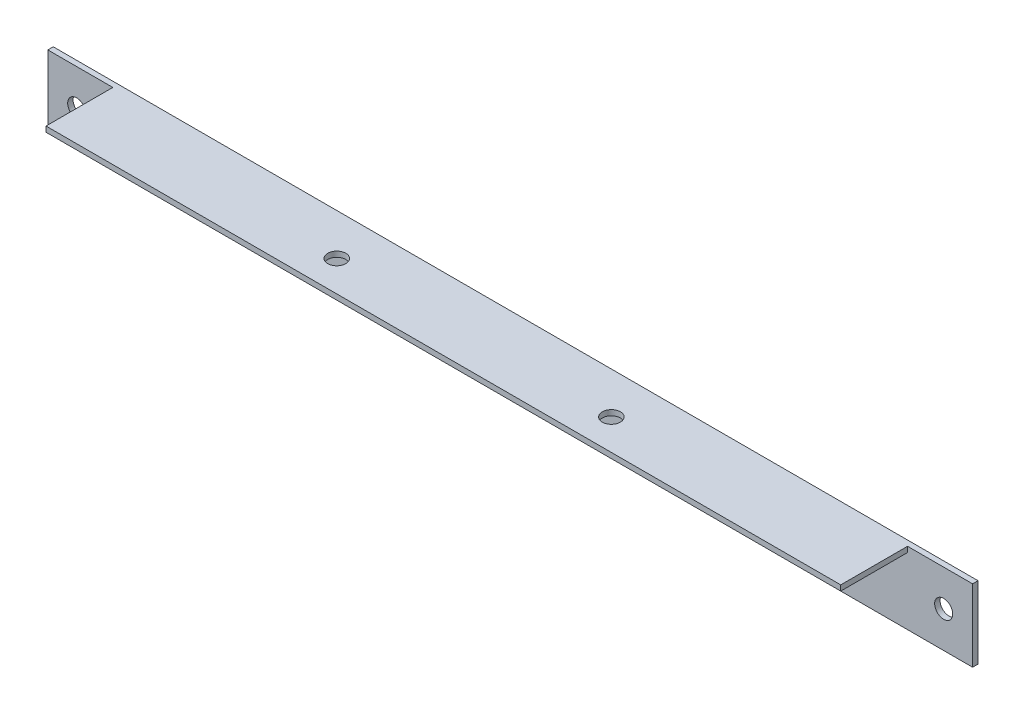
ISO-10303-21;
HEADER;
FILE_DESCRIPTION(('STEP AP214'),'2;1');
FILE_NAME('part.step','',(''),(''),'','','');
FILE_SCHEMA(('AUTOMOTIVE_DESIGN { 1 0 10303 214 1 1 1 1 }'));
ENDSEC;
DATA;
#1=APPLICATION_CONTEXT('core data for automotive mechanical design processes');
#2=APPLICATION_PROTOCOL_DEFINITION('international standard','automotive_design',2000,#1);
#3=PRODUCT_CONTEXT('',#1,'mechanical');
#4=PRODUCT('Part','Part','',(#3));
#5=PRODUCT_RELATED_PRODUCT_CATEGORY('part','',(#4));
#6=PRODUCT_DEFINITION_FORMATION('','',#4);
#7=PRODUCT_DEFINITION_CONTEXT('part definition',#1,'design');
#8=PRODUCT_DEFINITION('design','',#6,#7);
#9=PRODUCT_DEFINITION_SHAPE('','',#8);
#10=(LENGTH_UNIT() NAMED_UNIT(*) SI_UNIT(.MILLI.,.METRE.));
#11=(NAMED_UNIT(*) PLANE_ANGLE_UNIT() SI_UNIT($,.RADIAN.));
#12=(NAMED_UNIT(*) SI_UNIT($,.STERADIAN.) SOLID_ANGLE_UNIT());
#13=UNCERTAINTY_MEASURE_WITH_UNIT(LENGTH_MEASURE(1.E-05),#10,'distance_accuracy_value','');
#14=(GEOMETRIC_REPRESENTATION_CONTEXT(3) GLOBAL_UNCERTAINTY_ASSIGNED_CONTEXT((#13)) GLOBAL_UNIT_ASSIGNED_CONTEXT((#10,
#11,#12)) REPRESENTATION_CONTEXT('',''));
#15=CARTESIAN_POINT('',(0.,0.,0.));
#16=DIRECTION('',(0.,0.,1.));
#17=DIRECTION('',(1.,0.,0.));
#18=AXIS2_PLACEMENT_3D('',#15,#16,#17);
#19=CARTESIAN_POINT('',(128.,0.,1.5));
#20=DIRECTION('',(0.,0.,-1.));
#21=DIRECTION('',(0.,1.,0.));
#22=AXIS2_PLACEMENT_3D('',#19,#20,#21);
#23=PLANE('',#22);
#24=CARTESIAN_POINT('',(120.,-9.99999999999995,1.5));
#25=DIRECTION('',(0.,0.,1.));
#26=DIRECTION('',(-1.,0.,0.));
#27=AXIS2_PLACEMENT_3D('',#24,#25,#26);
#28=CIRCLE('',#27,2.5);
#29=CARTESIAN_POINT('',(117.5,-9.99999999999995,1.5));
#30=VERTEX_POINT('',#29);
#31=EDGE_CURVE('E152',#30,#30,#28,.T.);
#32=ORIENTED_EDGE('',*,*,#31,.F.);
#33=EDGE_LOOP('',(#32));
#34=FACE_BOUND('',#33,.T.);
#35=CARTESIAN_POINT('',(-120.,-9.99999999999995,1.5));
#36=DIRECTION('',(0.,0.,1.));
#37=DIRECTION('',(1.,0.,0.));
#38=AXIS2_PLACEMENT_3D('',#35,#36,#37);
#39=CIRCLE('',#38,2.5);
#40=CARTESIAN_POINT('',(-117.5,-9.99999999999995,1.5));
#41=VERTEX_POINT('',#40);
#42=EDGE_CURVE('E142',#41,#41,#39,.T.);
#43=ORIENTED_EDGE('',*,*,#42,.F.);
#44=EDGE_LOOP('',(#43));
#45=FACE_BOUND('',#44,.T.);
#46=DIRECTION('',(0.,-1.,0.));
#47=VECTOR('',#46,1.);
#48=CARTESIAN_POINT('',(-128.,0.,1.5));
#49=LINE('',#48,#47);
#50=CARTESIAN_POINT('',(-128.,0.,1.5));
#51=VERTEX_POINT('',#50);
#52=CARTESIAN_POINT('',(-128.,-20.,1.5));
#53=VERTEX_POINT('',#52);
#54=EDGE_CURVE('E49',#51,#53,#49,.T.);
#55=ORIENTED_EDGE('',*,*,#54,.T.);
#56=DIRECTION('',(-1.,0.,0.));
#57=VECTOR('',#56,1.);
#58=CARTESIAN_POINT('',(128.,-20.,1.5));
#59=LINE('',#58,#57);
#60=CARTESIAN_POINT('',(128.,-20.,1.5));
#61=VERTEX_POINT('',#60);
#62=EDGE_CURVE('E11',#61,#53,#59,.T.);
#63=ORIENTED_EDGE('',*,*,#62,.F.);
#64=DIRECTION('',(0.,-1.,0.));
#65=VECTOR('',#64,1.);
#66=CARTESIAN_POINT('',(128.,0.,1.5));
#67=LINE('',#66,#65);
#68=CARTESIAN_POINT('',(128.,0.,1.5));
#69=VERTEX_POINT('',#68);
#70=EDGE_CURVE('E78',#69,#61,#67,.T.);
#71=ORIENTED_EDGE('',*,*,#70,.F.);
#72=DIRECTION('',(-1.,0.,0.));
#73=VECTOR('',#72,1.);
#74=CARTESIAN_POINT('',(128.,0.,1.5));
#75=LINE('',#74,#73);
#76=CARTESIAN_POINT('',(110.,0.,1.5));
#77=VERTEX_POINT('',#76);
#78=EDGE_CURVE('E185',#69,#77,#75,.T.);
#79=ORIENTED_EDGE('',*,*,#78,.T.);
#80=DIRECTION('',(0.,-1.,0.));
#81=VECTOR('',#80,1.);
#82=CARTESIAN_POINT('',(110.,8.5,1.5));
#83=LINE('',#82,#81);
#84=CARTESIAN_POINT('',(110.,-1.5,1.5));
#85=VERTEX_POINT('',#84);
#86=EDGE_CURVE('E119',#77,#85,#83,.T.);
#87=ORIENTED_EDGE('',*,*,#86,.T.);
#88=DIRECTION('',(-1.,0.,0.));
#89=VECTOR('',#88,1.);
#90=CARTESIAN_POINT('',(128.,-1.5,1.5));
#91=LINE('',#90,#89);
#92=CARTESIAN_POINT('',(-110.,-1.5,1.5));
#93=VERTEX_POINT('',#92);
#94=EDGE_CURVE('E126',#85,#93,#91,.T.);
#95=ORIENTED_EDGE('',*,*,#94,.T.);
#96=DIRECTION('',(0.,-1.,0.));
#97=VECTOR('',#96,1.);
#98=CARTESIAN_POINT('',(-110.,8.5,1.5));
#99=LINE('',#98,#97);
#100=CARTESIAN_POINT('',(-110.,0.,1.5));
#101=VERTEX_POINT('',#100);
#102=EDGE_CURVE('E179',#101,#93,#99,.T.);
#103=ORIENTED_EDGE('',*,*,#102,.F.);
#104=DIRECTION('',(-1.,0.,0.));
#105=VECTOR('',#104,1.);
#106=CARTESIAN_POINT('',(128.,0.,1.5));
#107=LINE('',#106,#105);
#108=EDGE_CURVE('E177',#101,#51,#107,.T.);
#109=ORIENTED_EDGE('',*,*,#108,.T.);
#110=EDGE_LOOP('',(#55,#63,#71,#79,#87,#95,#103,#109));
#111=FACE_BOUND('',#110,.T.);
#112=ADVANCED_FACE('F33',(#34,#45,#111),#23,.F.);
#113=CARTESIAN_POINT('',(128.,-20.,0.));
#114=DIRECTION('',(0.,-1.,0.));
#115=DIRECTION('',(0.,0.,-1.));
#116=AXIS2_PLACEMENT_3D('',#113,#114,#115);
#117=PLANE('',#116);
#118=DIRECTION('',(0.,0.,1.));
#119=VECTOR('',#118,1.);
#120=CARTESIAN_POINT('',(-128.,-20.,0.));
#121=LINE('',#120,#119);
#122=CARTESIAN_POINT('',(-128.,-20.,0.));
#123=VERTEX_POINT('',#122);
#124=EDGE_CURVE('E145',#123,#53,#121,.T.);
#125=ORIENTED_EDGE('',*,*,#124,.F.);
#126=DIRECTION('',(-1.,0.,0.));
#127=VECTOR('',#126,1.);
#128=CARTESIAN_POINT('',(128.,-20.,0.));
#129=LINE('',#128,#127);
#130=CARTESIAN_POINT('',(128.,-20.,0.));
#131=VERTEX_POINT('',#130);
#132=EDGE_CURVE('E41',#131,#123,#129,.T.);
#133=ORIENTED_EDGE('',*,*,#132,.F.);
#134=DIRECTION('',(0.,0.,1.));
#135=VECTOR('',#134,1.);
#136=CARTESIAN_POINT('',(128.,-20.,0.));
#137=LINE('',#136,#135);
#138=EDGE_CURVE('E157',#131,#61,#137,.T.);
#139=ORIENTED_EDGE('',*,*,#138,.T.);
#140=ORIENTED_EDGE('',*,*,#62,.T.);
#141=EDGE_LOOP('',(#125,#133,#139,#140));
#142=FACE_BOUND('',#141,.T.);
#143=ADVANCED_FACE('F173',(#142),#117,.T.);
#144=CARTESIAN_POINT('',(128.,0.,0.));
#145=DIRECTION('',(0.,0.,-1.));
#146=DIRECTION('',(0.,1.,0.));
#147=AXIS2_PLACEMENT_3D('',#144,#145,#146);
#148=PLANE('',#147);
#149=CARTESIAN_POINT('',(120.,-9.99999999999995,0.));
#150=DIRECTION('',(0.,0.,-1.));
#151=DIRECTION('',(0.,1.,0.));
#152=AXIS2_PLACEMENT_3D('',#149,#150,#151);
#153=CIRCLE('',#152,2.5);
#154=CARTESIAN_POINT('',(120.,-7.49999999999996,0.));
#155=VERTEX_POINT('',#154);
#156=EDGE_CURVE('E36',#155,#155,#153,.T.);
#157=ORIENTED_EDGE('',*,*,#156,.F.);
#158=EDGE_LOOP('',(#157));
#159=FACE_BOUND('',#158,.T.);
#160=CARTESIAN_POINT('',(-120.,-9.99999999999995,0.));
#161=DIRECTION('',(0.,0.,-1.));
#162=DIRECTION('',(0.,1.,0.));
#163=AXIS2_PLACEMENT_3D('',#160,#161,#162);
#164=CIRCLE('',#163,2.5);
#165=CARTESIAN_POINT('',(-120.,-7.49999999999996,0.));
#166=VERTEX_POINT('',#165);
#167=EDGE_CURVE('E140',#166,#166,#164,.T.);
#168=ORIENTED_EDGE('',*,*,#167,.F.);
#169=EDGE_LOOP('',(#168));
#170=FACE_BOUND('',#169,.T.);
#171=DIRECTION('',(0.,-1.,0.));
#172=VECTOR('',#171,1.);
#173=CARTESIAN_POINT('',(-128.,0.,0.));
#174=LINE('',#173,#172);
#175=CARTESIAN_POINT('',(-128.,0.,0.));
#176=VERTEX_POINT('',#175);
#177=EDGE_CURVE('E165',#176,#123,#174,.T.);
#178=ORIENTED_EDGE('',*,*,#177,.F.);
#179=DIRECTION('',(-1.,0.,0.));
#180=VECTOR('',#179,1.);
#181=CARTESIAN_POINT('',(128.,0.,0.));
#182=LINE('',#181,#180);
#183=CARTESIAN_POINT('',(128.,0.,0.));
#184=VERTEX_POINT('',#183);
#185=EDGE_CURVE('E134',#184,#176,#182,.T.);
#186=ORIENTED_EDGE('',*,*,#185,.F.);
#187=DIRECTION('',(0.,-1.,0.));
#188=VECTOR('',#187,1.);
#189=CARTESIAN_POINT('',(128.,0.,0.));
#190=LINE('',#189,#188);
#191=EDGE_CURVE('E160',#184,#131,#190,.T.);
#192=ORIENTED_EDGE('',*,*,#191,.T.);
#193=ORIENTED_EDGE('',*,*,#132,.T.);
#194=EDGE_LOOP('',(#178,#186,#192,#193));
#195=FACE_BOUND('',#194,.T.);
#196=ADVANCED_FACE('F170',(#159,#170,#195),#148,.T.);
#197=CARTESIAN_POINT('',(128.,0.,20.));
#198=DIRECTION('',(0.,1.,0.));
#199=DIRECTION('',(0.,0.,1.));
#200=AXIS2_PLACEMENT_3D('',#197,#198,#199);
#201=PLANE('',#200);
#202=ORIENTED_EDGE('',*,*,#78,.F.);
#203=DIRECTION('',(0.,0.,-1.));
#204=VECTOR('',#203,1.);
#205=CARTESIAN_POINT('',(128.,0.,20.));
#206=LINE('',#205,#204);
#207=EDGE_CURVE('E58',#69,#184,#206,.T.);
#208=ORIENTED_EDGE('',*,*,#207,.T.);
#209=ORIENTED_EDGE('',*,*,#185,.T.);
#210=DIRECTION('',(0.,0.,-1.));
#211=VECTOR('',#210,1.);
#212=CARTESIAN_POINT('',(-128.,0.,20.));
#213=LINE('',#212,#211);
#214=EDGE_CURVE('E73',#51,#176,#213,.T.);
#215=ORIENTED_EDGE('',*,*,#214,.F.);
#216=ORIENTED_EDGE('',*,*,#108,.F.);
#217=DIRECTION('',(0.,0.,-1.));
#218=VECTOR('',#217,1.);
#219=CARTESIAN_POINT('',(-110.,0.,19.9999999999998));
#220=LINE('',#219,#218);
#221=CARTESIAN_POINT('',(-110.,0.,20.));
#222=VERTEX_POINT('',#221);
#223=EDGE_CURVE('E181',#222,#101,#220,.T.);
#224=ORIENTED_EDGE('',*,*,#223,.F.);
#225=DIRECTION('',(-1.,0.,0.));
#226=VECTOR('',#225,1.);
#227=CARTESIAN_POINT('',(128.,0.,20.));
#228=LINE('',#227,#226);
#229=CARTESIAN_POINT('',(110.,0.,20.));
#230=VERTEX_POINT('',#229);
#231=EDGE_CURVE('E132',#230,#222,#228,.T.);
#232=ORIENTED_EDGE('',*,*,#231,.F.);
#233=DIRECTION('',(0.,0.,1.));
#234=VECTOR('',#233,1.);
#235=CARTESIAN_POINT('',(110.,0.,20.));
#236=LINE('',#235,#234);
#237=EDGE_CURVE('E115',#77,#230,#236,.T.);
#238=ORIENTED_EDGE('',*,*,#237,.F.);
#239=EDGE_LOOP('',(#202,#208,#209,#215,#216,#224,#232,#238));
#240=FACE_BOUND('',#239,.T.);
#241=CARTESIAN_POINT('',(38.,0.,11.5));
#242=DIRECTION('',(0.,1.,0.));
#243=DIRECTION('',(0.,0.,1.));
#244=AXIS2_PLACEMENT_3D('',#241,#242,#243);
#245=CIRCLE('',#244,2.5);
#246=CARTESIAN_POINT('',(38.,0.,14.));
#247=VERTEX_POINT('',#246);
#248=EDGE_CURVE('E191',#247,#247,#245,.T.);
#249=ORIENTED_EDGE('',*,*,#248,.F.);
#250=EDGE_LOOP('',(#249));
#251=FACE_BOUND('',#250,.T.);
#252=CARTESIAN_POINT('',(-38.,0.,11.5));
#253=DIRECTION('',(0.,1.,0.));
#254=DIRECTION('',(0.,0.,1.));
#255=AXIS2_PLACEMENT_3D('',#252,#253,#254);
#256=CIRCLE('',#255,2.5);
#257=CARTESIAN_POINT('',(-38.,0.,14.));
#258=VERTEX_POINT('',#257);
#259=EDGE_CURVE('E194',#258,#258,#256,.T.);
#260=ORIENTED_EDGE('',*,*,#259,.F.);
#261=EDGE_LOOP('',(#260));
#262=FACE_BOUND('',#261,.T.);
#263=ADVANCED_FACE('F183',(#240,#251,#262),#201,.T.);
#264=CARTESIAN_POINT('',(128.,-1.5,20.));
#265=DIRECTION('',(0.,0.,1.));
#266=DIRECTION('',(1.,0.,0.));
#267=AXIS2_PLACEMENT_3D('',#264,#265,#266);
#268=PLANE('',#267);
#269=DIRECTION('',(0.,-1.,0.));
#270=VECTOR('',#269,1.);
#271=CARTESIAN_POINT('',(110.,8.5,20.));
#272=LINE('',#271,#270);
#273=CARTESIAN_POINT('',(110.,-1.5,20.));
#274=VERTEX_POINT('',#273);
#275=EDGE_CURVE('E108',#230,#274,#272,.T.);
#276=ORIENTED_EDGE('',*,*,#275,.F.);
#277=ORIENTED_EDGE('',*,*,#231,.T.);
#278=DIRECTION('',(0.,-1.,0.));
#279=VECTOR('',#278,1.);
#280=CARTESIAN_POINT('',(-110.,8.5,20.));
#281=LINE('',#280,#279);
#282=CARTESIAN_POINT('',(-110.,-1.5,20.));
#283=VERTEX_POINT('',#282);
#284=EDGE_CURVE('E131',#222,#283,#281,.T.);
#285=ORIENTED_EDGE('',*,*,#284,.T.);
#286=DIRECTION('',(-1.,0.,0.));
#287=VECTOR('',#286,1.);
#288=CARTESIAN_POINT('',(128.,-1.5,20.));
#289=LINE('',#288,#287);
#290=EDGE_CURVE('E124',#274,#283,#289,.T.);
#291=ORIENTED_EDGE('',*,*,#290,.F.);
#292=EDGE_LOOP('',(#276,#277,#285,#291));
#293=FACE_BOUND('',#292,.T.);
#294=ADVANCED_FACE('F129',(#293),#268,.T.);
#295=CARTESIAN_POINT('',(128.,-1.5,20.));
#296=DIRECTION('',(0.,1.,0.));
#297=DIRECTION('',(0.,0.,1.));
#298=AXIS2_PLACEMENT_3D('',#295,#296,#297);
#299=PLANE('',#298);
#300=CARTESIAN_POINT('',(38.,-1.5,11.5));
#301=DIRECTION('',(0.,-1.,0.));
#302=DIRECTION('',(0.,0.,1.));
#303=AXIS2_PLACEMENT_3D('',#300,#301,#302);
#304=CIRCLE('',#303,2.5);
#305=CARTESIAN_POINT('',(38.,-1.5,14.));
#306=VERTEX_POINT('',#305);
#307=EDGE_CURVE('E207',#306,#306,#304,.T.);
#308=ORIENTED_EDGE('',*,*,#307,.F.);
#309=EDGE_LOOP('',(#308));
#310=FACE_BOUND('',#309,.T.);
#311=CARTESIAN_POINT('',(-38.,-1.5,11.5));
#312=DIRECTION('',(0.,-1.,0.));
#313=DIRECTION('',(0.,0.,-1.));
#314=AXIS2_PLACEMENT_3D('',#311,#312,#313);
#315=CIRCLE('',#314,2.5);
#316=CARTESIAN_POINT('',(-38.,-1.5,9.));
#317=VERTEX_POINT('',#316);
#318=EDGE_CURVE('E196',#317,#317,#315,.T.);
#319=ORIENTED_EDGE('',*,*,#318,.F.);
#320=EDGE_LOOP('',(#319));
#321=FACE_BOUND('',#320,.T.);
#322=ORIENTED_EDGE('',*,*,#94,.F.);
#323=DIRECTION('',(0.,0.,-1.));
#324=VECTOR('',#323,1.);
#325=CARTESIAN_POINT('',(110.,-1.5,20.));
#326=LINE('',#325,#324);
#327=EDGE_CURVE('E112',#274,#85,#326,.T.);
#328=ORIENTED_EDGE('',*,*,#327,.F.);
#329=ORIENTED_EDGE('',*,*,#290,.T.);
#330=DIRECTION('',(0.,0.,1.));
#331=VECTOR('',#330,1.);
#332=CARTESIAN_POINT('',(-110.,-1.5,20.));
#333=LINE('',#332,#331);
#334=EDGE_CURVE('E203',#93,#283,#333,.T.);
#335=ORIENTED_EDGE('',*,*,#334,.F.);
#336=EDGE_LOOP('',(#322,#328,#329,#335));
#337=FACE_BOUND('',#336,.T.);
#338=ADVANCED_FACE('F122',(#310,#321,#337),#299,.F.);
#339=CARTESIAN_POINT('',(128.,0.,0.));
#340=DIRECTION('',(-1.,0.,0.));
#341=DIRECTION('',(0.,0.,1.));
#342=AXIS2_PLACEMENT_3D('',#339,#340,#341);
#343=PLANE('',#342);
#344=ORIENTED_EDGE('',*,*,#207,.F.);
#345=ORIENTED_EDGE('',*,*,#70,.T.);
#346=ORIENTED_EDGE('',*,*,#138,.F.);
#347=ORIENTED_EDGE('',*,*,#191,.F.);
#348=EDGE_LOOP('',(#344,#345,#346,#347));
#349=FACE_BOUND('',#348,.T.);
#350=ADVANCED_FACE('F243',(#349),#343,.F.);
#351=CARTESIAN_POINT('',(-128.,0.,0.));
#352=DIRECTION('',(-1.,0.,0.));
#353=DIRECTION('',(0.,0.,1.));
#354=AXIS2_PLACEMENT_3D('',#351,#352,#353);
#355=PLANE('',#354);
#356=ORIENTED_EDGE('',*,*,#54,.F.);
#357=ORIENTED_EDGE('',*,*,#214,.T.);
#358=ORIENTED_EDGE('',*,*,#177,.T.);
#359=ORIENTED_EDGE('',*,*,#124,.T.);
#360=EDGE_LOOP('',(#356,#357,#358,#359));
#361=FACE_BOUND('',#360,.T.);
#362=ADVANCED_FACE('F167',(#361),#355,.T.);
#363=CARTESIAN_POINT('',(-120.,-9.99999999999995,-8.5));
#364=DIRECTION('',(0.,0.,1.));
#365=DIRECTION('',(1.,0.,0.));
#366=AXIS2_PLACEMENT_3D('',#363,#364,#365);
#367=CYLINDRICAL_SURFACE('',#366,2.5);
#368=ORIENTED_EDGE('',*,*,#167,.T.);
#369=EDGE_LOOP('',(#368));
#370=FACE_BOUND('',#369,.T.);
#371=ORIENTED_EDGE('',*,*,#42,.T.);
#372=EDGE_LOOP('',(#371));
#373=FACE_BOUND('',#372,.T.);
#374=ADVANCED_FACE('F235',(#370,#373),#367,.F.);
#375=CARTESIAN_POINT('',(120.,-9.99999999999995,-8.5));
#376=DIRECTION('',(0.,0.,1.));
#377=DIRECTION('',(1.,0.,0.));
#378=AXIS2_PLACEMENT_3D('',#375,#376,#377);
#379=CYLINDRICAL_SURFACE('',#378,2.5);
#380=ORIENTED_EDGE('',*,*,#156,.T.);
#381=EDGE_LOOP('',(#380));
#382=FACE_BOUND('',#381,.T.);
#383=ORIENTED_EDGE('',*,*,#31,.T.);
#384=EDGE_LOOP('',(#383));
#385=FACE_BOUND('',#384,.T.);
#386=ADVANCED_FACE('F224',(#382,#385),#379,.F.);
#387=CARTESIAN_POINT('',(-38.,8.5,11.5));
#388=DIRECTION('',(0.,-1.,0.));
#389=DIRECTION('',(0.,0.,-1.));
#390=AXIS2_PLACEMENT_3D('',#387,#388,#389);
#391=CYLINDRICAL_SURFACE('',#390,2.5);
#392=ORIENTED_EDGE('',*,*,#259,.T.);
#393=EDGE_LOOP('',(#392));
#394=FACE_BOUND('',#393,.T.);
#395=ORIENTED_EDGE('',*,*,#318,.T.);
#396=EDGE_LOOP('',(#395));
#397=FACE_BOUND('',#396,.T.);
#398=ADVANCED_FACE('F216',(#394,#397),#391,.F.);
#399=CARTESIAN_POINT('',(-110.,8.5,20.));
#400=DIRECTION('',(1.,0.,0.));
#401=DIRECTION('',(0.,0.,-1.));
#402=AXIS2_PLACEMENT_3D('',#399,#400,#401);
#403=PLANE('',#402);
#404=ORIENTED_EDGE('',*,*,#223,.T.);
#405=ORIENTED_EDGE('',*,*,#102,.T.);
#406=ORIENTED_EDGE('',*,*,#334,.T.);
#407=ORIENTED_EDGE('',*,*,#284,.F.);
#408=EDGE_LOOP('',(#404,#405,#406,#407));
#409=FACE_BOUND('',#408,.T.);
#410=ADVANCED_FACE('F213',(#409),#403,.F.);
#411=CARTESIAN_POINT('',(38.,8.5,11.5));
#412=DIRECTION('',(0.,-1.,0.));
#413=DIRECTION('',(0.,0.,-1.));
#414=AXIS2_PLACEMENT_3D('',#411,#412,#413);
#415=CYLINDRICAL_SURFACE('',#414,2.5);
#416=ORIENTED_EDGE('',*,*,#248,.T.);
#417=EDGE_LOOP('',(#416));
#418=FACE_BOUND('',#417,.T.);
#419=ORIENTED_EDGE('',*,*,#307,.T.);
#420=EDGE_LOOP('',(#419));
#421=FACE_BOUND('',#420,.T.);
#422=ADVANCED_FACE('F215',(#418,#421),#415,.F.);
#423=CARTESIAN_POINT('',(110.,8.5,20.));
#424=DIRECTION('',(-1.,0.,0.));
#425=DIRECTION('',(0.,0.,1.));
#426=AXIS2_PLACEMENT_3D('',#423,#424,#425);
#427=PLANE('',#426);
#428=ORIENTED_EDGE('',*,*,#237,.T.);
#429=ORIENTED_EDGE('',*,*,#275,.T.);
#430=ORIENTED_EDGE('',*,*,#327,.T.);
#431=ORIENTED_EDGE('',*,*,#86,.F.);
#432=EDGE_LOOP('',(#428,#429,#430,#431));
#433=FACE_BOUND('',#432,.T.);
#434=ADVANCED_FACE('F110',(#433),#427,.F.);
#435=CLOSED_SHELL('',(#112,#143,#196,#263,#294,#338,#350,#362,#374,#386,#398,#410,#422,#434));
#436=MANIFOLD_SOLID_BREP('B2',#435);
#437=ADVANCED_BREP_SHAPE_REPRESENTATION('',(#18,#436),#14);
#438=SHAPE_DEFINITION_REPRESENTATION(#9,#437);
ENDSEC;
END-ISO-10303-21;
